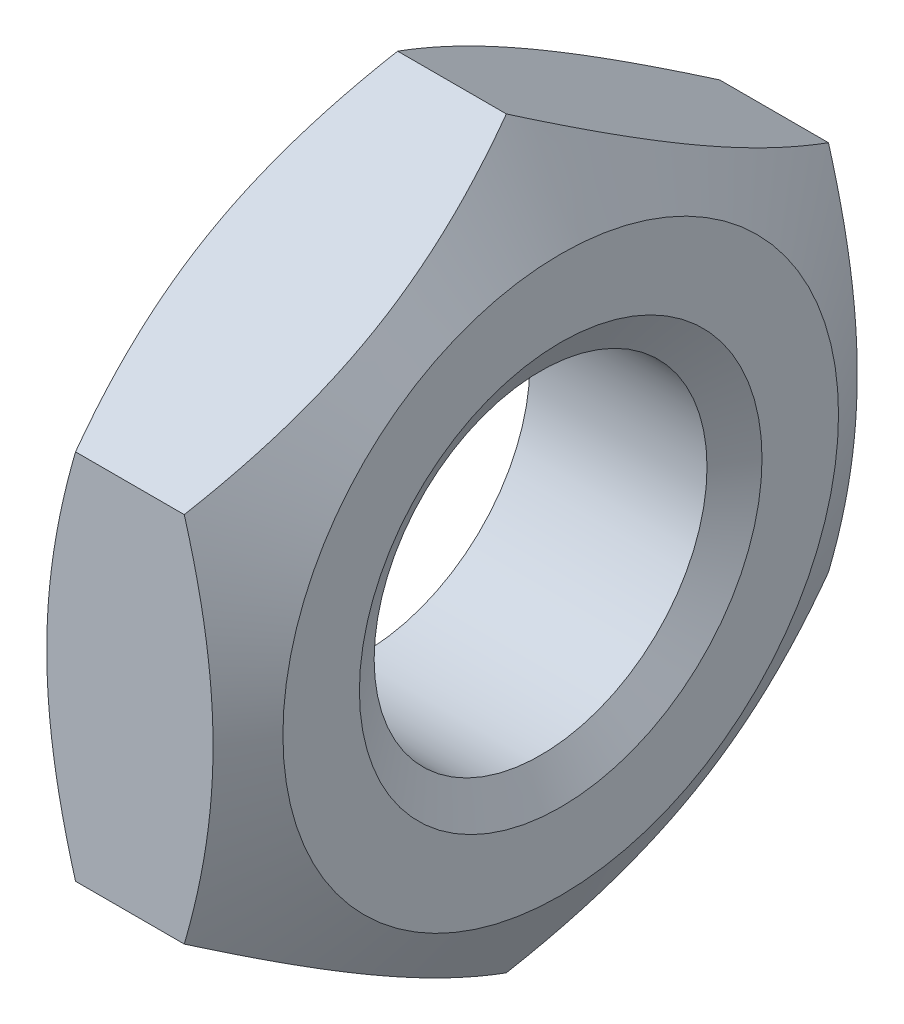
ISO-10303-21;
HEADER;
FILE_DESCRIPTION(('STEP AP214'),'2;1');
FILE_NAME('part.step','',(''),(''),'','','');
FILE_SCHEMA(('AUTOMOTIVE_DESIGN { 1 0 10303 214 1 1 1 1 }'));
ENDSEC;
DATA;
#1=APPLICATION_CONTEXT('core data for automotive mechanical design processes');
#2=APPLICATION_PROTOCOL_DEFINITION('international standard','automotive_design',2000,#1);
#3=PRODUCT_CONTEXT('',#1,'mechanical');
#4=PRODUCT('Part','Part','',(#3));
#5=PRODUCT_RELATED_PRODUCT_CATEGORY('part','',(#4));
#6=PRODUCT_DEFINITION_FORMATION('','',#4);
#7=PRODUCT_DEFINITION_CONTEXT('part definition',#1,'design');
#8=PRODUCT_DEFINITION('design','',#6,#7);
#9=PRODUCT_DEFINITION_SHAPE('','',#8);
#10=(LENGTH_UNIT() NAMED_UNIT(*) SI_UNIT(.MILLI.,.METRE.));
#11=(NAMED_UNIT(*) PLANE_ANGLE_UNIT() SI_UNIT($,.RADIAN.));
#12=(NAMED_UNIT(*) SI_UNIT($,.STERADIAN.) SOLID_ANGLE_UNIT());
#13=UNCERTAINTY_MEASURE_WITH_UNIT(LENGTH_MEASURE(1.E-05),#10,'distance_accuracy_value','');
#14=(GEOMETRIC_REPRESENTATION_CONTEXT(3) GLOBAL_UNCERTAINTY_ASSIGNED_CONTEXT((#13)) GLOBAL_UNIT_ASSIGNED_CONTEXT((#10,
#11,#12)) REPRESENTATION_CONTEXT('',''));
#15=CARTESIAN_POINT('',(0.,0.,0.));
#16=DIRECTION('',(0.,0.,1.));
#17=DIRECTION('',(1.,0.,0.));
#18=AXIS2_PLACEMENT_3D('',#15,#16,#17);
#19=CARTESIAN_POINT('',(0.,-2.3094010767585,4.));
#20=DIRECTION('',(0.,0.,1.));
#21=DIRECTION('',(1.,0.,0.));
#22=AXIS2_PLACEMENT_3D('',#19,#20,#21);
#23=PLANE('',#22);
#24=CARTESIAN_POINT('',(2.02519172902946,2.30940110330032,3.99999996266875));
#25=CARTESIAN_POINT('',(2.08380065489005,2.10643272223138,3.99999998659229));
#26=CARTESIAN_POINT('',(2.13710239838394,1.90171231870286,3.99999999640651));
#27=CARTESIAN_POINT('',(2.23013898474599,1.48872691297369,4.00000000360213));
#28=CARTESIAN_POINT('',(2.26984091838746,1.28045457520873,4.0000000009536));
#29=CARTESIAN_POINT('',(2.33163984180098,0.866490915195501,3.99999999907));
#30=CARTESIAN_POINT('',(2.35414818560107,0.660863268713691,3.99999999975209));
#31=CARTESIAN_POINT('',(2.38101342577776,0.248640934240581,4.0000000002476));
#32=CARTESIAN_POINT('',(2.38539257422497,0.0420477435369604,4.00000000006209));
#33=CARTESIAN_POINT('',(2.37625918202696,-0.343949461151199,3.99999999994595));
#34=CARTESIAN_POINT('',(2.36498919270018,-0.523411397187139,3.99999999998543));
#35=CARTESIAN_POINT('',(2.32927716423957,-0.881166133306312,4.00000000001458));
#36=CARTESIAN_POINT('',(2.30482293789213,-1.05945769693567,4.0000000000042));
#37=CARTESIAN_POINT('',(2.24369210505748,-1.41794944174713,3.9999999999957));
#38=CARTESIAN_POINT('',(2.20675648986175,-1.59810427385144,3.99999999999785));
#39=CARTESIAN_POINT('',(2.12292825825384,-1.9557277061086,4.00000000000214));
#40=CARTESIAN_POINT('',(2.07605532549025,-2.13320088429495,4.00000000000428));
#41=CARTESIAN_POINT('',(2.02519178619822,-2.30940098992733,4.));
#42=B_SPLINE_CURVE_WITH_KNOTS('',3,(#24,#25,#26,#27,#28,#29,#30,#31,#32,#33,#34,#35,#36,#37,#38,
#39,#40,#41),.UNSPECIFIED.,.F.,.F.,(4,2,2,2,2,2,2,2,4),(0.,0.634032032068211,1.26958765129333,
1.8894152364649,2.50848180915627,3.04741557495782,3.58684837536442,4.1382432105287,
4.68855589077481),.UNSPECIFIED.);
#43=CARTESIAN_POINT('',(2.02519177366592,2.3094010984675,3.99999996239891));
#44=VERTEX_POINT('',#43);
#45=CARTESIAN_POINT('',(2.0251917736691,-2.30940103332947,4.));
#46=VERTEX_POINT('',#45);
#47=EDGE_CURVE('E92',#44,#46,#42,.T.);
#48=ORIENTED_EDGE('',*,*,#47,.F.);
#49=DIRECTION('',(1.,0.,0.));
#50=VECTOR('',#49,1.);
#51=CARTESIAN_POINT('',(0.,2.3094010767585,4.));
#52=LINE('',#51,#50);
#53=CARTESIAN_POINT('',(0.674808226341169,2.30940103334992,4.));
#54=VERTEX_POINT('',#53);
#55=EDGE_CURVE('E80',#54,#44,#52,.T.);
#56=ORIENTED_EDGE('',*,*,#55,.F.);
#57=CARTESIAN_POINT('',(0.674808213697576,-2.30940098993405,4.0000000001688));
#58=CARTESIAN_POINT('',(0.616199305908313,-2.10643260917216,4.00000000006062));
#59=CARTESIAN_POINT('',(0.562897571915449,-1.90171220823269,4.00000000001625));
#60=CARTESIAN_POINT('',(0.469860996806368,-1.48872680966051,3.99999999998371));
#61=CARTESIAN_POINT('',(0.430159064910296,-1.28045447646598,3.99999999999569));
#62=CARTESIAN_POINT('',(0.368360146600821,-0.86649082466348,4.0000000000042));
#63=CARTESIAN_POINT('',(0.34585180615922,-0.660863181822002,4.00000000000112));
#64=CARTESIAN_POINT('',(0.318986571642112,-0.248640855097901,3.99999999999888));
#65=CARTESIAN_POINT('',(0.314607425490309,-0.042047668502941,3.99999999999972));
#66=CARTESIAN_POINT('',(0.323740821321169,0.343949526319326,4.00000000000024));
#67=CARTESIAN_POINT('',(0.335010811904148,0.52341145661859,4.00000000000007));
#68=CARTESIAN_POINT('',(0.370722841889489,0.881166181293737,3.99999999999993));
#69=CARTESIAN_POINT('',(0.395177068507638,1.05945773921543,3.99999999999998));
#70=CARTESIAN_POINT('',(0.456307900966008,1.41794947215574,4.00000000000002));
#71=CARTESIAN_POINT('',(0.493243515467248,1.59810429810382,4.00000000000001));
#72=CARTESIAN_POINT('',(0.57707174493397,1.95572771815517,3.99999999999999));
#73=CARTESIAN_POINT('',(0.623944676249181,2.13320089029238,3.99999999999998));
#74=CARTESIAN_POINT('',(0.67480821381843,2.30940098996988,4.));
#75=B_SPLINE_CURVE_WITH_KNOTS('',3,(#57,#58,#59,#60,#61,#62,#63,#64,#65,#66,#67,#68,#69,#70,#71,
#72,#73,#74),.UNSPECIFIED.,.F.,.F.,(4,2,2,2,2,2,2,2,4),(0.,0.634032017419487,1.26958762251684,
1.88941519556962,2.50848175591866,3.04741550481462,3.58684828842628,4.13824310511423,
4.6885557667468),.UNSPECIFIED.);
#76=CARTESIAN_POINT('',(0.674808243645541,-2.30940106849074,4.00000001432018));
#77=VERTEX_POINT('',#76);
#78=EDGE_CURVE('E240',#77,#54,#75,.T.);
#79=ORIENTED_EDGE('',*,*,#78,.F.);
#80=DIRECTION('',(1.,0.,0.));
#81=VECTOR('',#80,1.);
#82=CARTESIAN_POINT('',(0.,-2.3094010767585,4.));
#83=LINE('',#82,#81);
#84=EDGE_CURVE('E95',#46,#77,#83,.F.);
#85=ORIENTED_EDGE('',*,*,#84,.F.);
#86=EDGE_LOOP('',(#48,#56,#79,#85));
#87=FACE_BOUND('',#86,.T.);
#88=ADVANCED_FACE('F17',(#87),#23,.T.);
#89=CARTESIAN_POINT('',(0.,2.3094010767585,4.));
#90=DIRECTION('',(0.,0.866025403784438,0.5));
#91=DIRECTION('',(0.,-0.5,0.866025403784438));
#92=AXIS2_PLACEMENT_3D('',#89,#90,#91);
#93=PLANE('',#92);
#94=CARTESIAN_POINT('',(2.02519178630979,4.61880211027537,7.52639028100862E-08));
#95=CARTESIAN_POINT('',(2.08380069409352,4.51731791979203,0.175775849110728));
#96=CARTESIAN_POINT('',(2.13710242808434,4.41495771928044,0.353068916973205));
#97=CARTESIAN_POINT('',(2.23013900319252,4.20846501996394,0.710724763510652));
#98=CARTESIAN_POINT('',(2.26984093508974,4.10432885337824,0.89109389496859));
#99=CARTESIAN_POINT('',(2.33163985340084,3.89734702748539,1.24959693367691));
#100=CARTESIAN_POINT('',(2.35414819384293,3.79453320606185,1.42767569609609));
#101=CARTESIAN_POINT('',(2.3810134283613,3.5884220426979,1.78467070304471));
#102=CARTESIAN_POINT('',(2.38539257451389,3.48512544940133,1.96358565088497));
#103=CARTESIAN_POINT('',(2.37625917868444,3.29212685199066,2.29786902739092));
#104=CARTESIAN_POINT('',(2.36498918810206,3.20239588684072,2.45328761804243));
#105=CARTESIAN_POINT('',(2.32927715811784,3.02351852450271,2.76311229793547));
#106=CARTESIAN_POINT('',(2.30482293150021,2.93437274554174,2.91751731637628));
#107=CARTESIAN_POINT('',(2.24369209904278,2.75512687907132,3.22798026414984));
#108=CARTESIAN_POINT('',(2.20675648454197,2.66504946609713,3.38399892003548));
#109=CARTESIAN_POINT('',(2.122928255076,2.48623775607118,3.69370988678865));
#110=CARTESIAN_POINT('',(2.07605532376112,2.39750117000245,3.84740616234988));
#111=CARTESIAN_POINT('',(2.02519178619216,2.3094011201636,3.99999992482017));
#112=B_SPLINE_CURVE_WITH_KNOTS('',3,(#94,#95,#96,#97,#98,#99,#100,#101,#102,#103,#104,#105,#106,
#107,#108,#109,#110,#111),.UNSPECIFIED.,.F.,.F.,(4,2,2,2,2,2,2,2,4),(0.,0.634032017418265,
1.26958762251472,1.88941519556702,2.50848175591544,3.04741550481212,3.58684828842455,
4.13824310511304,4.68855576674605),.UNSPECIFIED.);
#113=CARTESIAN_POINT('',(2.0251917563553,4.61880216179087,1.43307475137956E-08));
#114=VERTEX_POINT('',#113);
#115=EDGE_CURVE('E21',#114,#44,#112,.T.);
#116=ORIENTED_EDGE('',*,*,#115,.F.);
#117=DIRECTION('',(1.,0.,0.));
#118=VECTOR('',#117,1.);
#119=CARTESIAN_POINT('',(0.,4.61880215351701,0.));
#120=LINE('',#119,#118);
#121=CARTESIAN_POINT('',(0.674808226338649,4.61880213180835,3.760049169793E-08));
#122=VERTEX_POINT('',#121);
#123=EDGE_CURVE('E73',#122,#114,#120,.T.);
#124=ORIENTED_EDGE('',*,*,#123,.F.);
#125=CARTESIAN_POINT('',(0.674808270972119,2.30940103115837,4.00000000435076));
#126=CARTESIAN_POINT('',(0.616199345117388,2.41088524240304,3.82422424213583));
#127=CARTESIAN_POINT('',(0.562897601625639,2.51324545266315,3.64693117691203));
#128=CARTESIAN_POINT('',(0.469861015264466,2.71973816175649,3.289275327755));
#129=CARTESIAN_POINT('',(0.430159081621735,2.82387432834596,3.10890619102175));
#130=CARTESIAN_POINT('',(0.368360158206409,3.03085615672164,2.75040314426596));
#131=CARTESIAN_POINT('',(0.345851814405762,3.13366998055291,2.57232437903338));
#132=CARTESIAN_POINT('',(0.318986574227663,3.33978114821819,2.21532936562037));
#133=CARTESIAN_POINT('',(0.314607425779577,3.44307774340929,2.03641441412964));
#134=CARTESIAN_POINT('',(0.32374081797613,3.63607634565498,1.70213102901815));
#135=CARTESIAN_POINT('',(0.335010807302671,3.72580731370938,1.54671243341451));
#136=CARTESIAN_POINT('',(0.370722835763484,3.90468468179872,1.23688774361786));
#137=CARTESIAN_POINT('',(0.395177062111381,3.99383046360667,1.08248272022529));
#138=CARTESIAN_POINT('',(0.45630789494754,4.17307633600956,0.772019762159473));
#139=CARTESIAN_POINT('',(0.493243510144345,4.26315375206584,0.616001100939776));
#140=CARTESIAN_POINT('',(0.57707174175484,4.44196546820258,0.306290123610946));
#141=CARTESIAN_POINT('',(0.623944674519954,4.53070205729978,0.152593842808506));
#142=CARTESIAN_POINT('',(0.674808213813643,4.61880211011441,7.51755118235889E-08));
#143=B_SPLINE_CURVE_WITH_KNOTS('',3,(#125,#126,#127,#128,#129,#130,#131,#132,#133,#134,#135,
#136,#137,#138,#139,#140,#141,#142),.UNSPECIFIED.,.F.,.F.,(4,2,2,2,2,2,2,2,4),(0.,
0.634032032067056,1.26958765129137,1.88941523646246,2.50848180915321,3.04741557496818,
3.58684837538834,4.13824321056657,4.68855589082641),.UNSPECIFIED.);
#144=EDGE_CURVE('E83',#54,#122,#143,.T.);
#145=ORIENTED_EDGE('',*,*,#144,.F.);
#146=ORIENTED_EDGE('',*,*,#55,.T.);
#147=EDGE_LOOP('',(#116,#124,#145,#146));
#148=FACE_BOUND('',#147,.T.);
#149=ADVANCED_FACE('F82',(#148),#93,.T.);
#150=CARTESIAN_POINT('',(0.,4.61880215351701,0.));
#151=DIRECTION('',(0.,0.866025403784439,-0.499999999999999));
#152=DIRECTION('',(0.,0.499999999999999,0.866025403784439));
#153=AXIS2_PLACEMENT_3D('',#150,#151,#152);
#154=PLANE('',#153);
#155=CARTESIAN_POINT('',(2.02519172902824,2.30940103115588,-4.00000000432196));
#156=CARTESIAN_POINT('',(2.08380065489977,2.41088524242771,-3.8242242420812));
#157=CARTESIAN_POINT('',(2.13710239840265,2.5132454527103,-3.64693117682718));
#158=CARTESIAN_POINT('',(2.23013898477805,2.71973816184712,-3.28927532760122));
#159=CARTESIAN_POINT('',(2.26984091842357,2.82387432845763,-3.10890619082919));
#160=CARTESIAN_POINT('',(2.33163984182479,3.03085615683632,-2.75040314406652));
#161=CARTESIAN_POINT('',(2.35414818561507,3.13366998064903,-2.57232437886667));
#162=CARTESIAN_POINT('',(2.38101342577998,3.33978114827347,-2.21532936552485));
#163=CARTESIAN_POINT('',(2.38539257422557,3.44307774344226,-2.03641441407259));
#164=CARTESIAN_POINT('',(2.37625918179789,3.63607635047929,-1.70213102066215));
#165=CARTESIAN_POINT('',(2.36498919148778,3.72580732333701,-1.54671241673896));
#166=CARTESIAN_POINT('',(2.32927715970763,3.9046847009531,-1.23688771044151));
#167=CARTESIAN_POINT('',(2.30482293102077,3.99383048748431,-1.08248267886802));
#168=CARTESIAN_POINT('',(2.24369209235289,4.17307636944309,-0.772019704250904));
#169=CARTESIAN_POINT('',(2.2067564736211,4.26315379032731,-0.616001034668968));
#170=CARTESIAN_POINT('',(2.12292823417202,4.44196551594428,-0.306290040919895));
#171=CARTESIAN_POINT('',(2.07605529710799,4.53070210969441,-0.15259375205835));
#172=CARTESIAN_POINT('',(2.02519175329197,4.61880216709671,2.35207428871448E-08));
#173=B_SPLINE_CURVE_WITH_KNOTS('',3,(#155,#156,#157,#158,#159,#160,#161,#162,#163,#164,#165,
#166,#167,#168,#169,#170,#171,#172),.UNSPECIFIED.,.F.,.F.,(4,2,2,2,2,2,2,2,4),(0.,
0.634032032183856,1.26958765153942,1.88941523659392,2.50848180915746,3.04741560383323,
3.58684843322087,4.13824329887117,4.68855600937118),.UNSPECIFIED.);
#174=CARTESIAN_POINT('',(2.02519177366628,2.30940103333923,-4.));
#175=VERTEX_POINT('',#174);
#176=EDGE_CURVE('E94',#175,#114,#173,.T.);
#177=ORIENTED_EDGE('',*,*,#176,.F.);
#178=DIRECTION('',(-1.,0.,0.));
#179=VECTOR('',#178,1.);
#180=CARTESIAN_POINT('',(0.,2.30940107675851,-4.));
#181=LINE('',#180,#179);
#182=CARTESIAN_POINT('',(0.674808226334158,2.30940109847495,-3.99999996238602));
#183=VERTEX_POINT('',#182);
#184=EDGE_CURVE('E224',#183,#175,#181,.F.);
#185=ORIENTED_EDGE('',*,*,#184,.F.);
#186=CARTESIAN_POINT('',(0.674808270980456,4.61880213448834,4.16832729183814E-08));
#187=CARTESIAN_POINT('',(0.616199345123098,4.51731796466597,-0.175775744446881));
#188=CARTESIAN_POINT('',(0.562897601629969,4.41495777139847,-0.353068819481787));
#189=CARTESIAN_POINT('',(0.469861015267162,4.20846507476345,-0.71072467583281));
#190=CARTESIAN_POINT('',(0.430159081624179,4.10432890358786,-0.891093809919018));
#191=CARTESIAN_POINT('',(0.368360158208106,3.89734707195025,-1.2495968547929));
#192=CARTESIAN_POINT('',(0.345851814406967,3.79453324929971,-1.4276756207078));
#193=CARTESIAN_POINT('',(0.318986574228041,3.58842208249181,-1.78467063461715));
#194=CARTESIAN_POINT('',(0.314607425779621,3.4851254869792,-1.96358558592296));
#195=CARTESIAN_POINT('',(0.323740817975579,3.29212688453309,-2.29786897091718));
#196=CARTESIAN_POINT('',(0.335010807301651,3.20239591654802,-2.4532875665586));
#197=CARTESIAN_POINT('',(0.370722835761278,3.0235185485111,-2.76311225638104));
#198=CARTESIAN_POINT('',(0.395177062108456,2.93437276668614,-2.91751727976157));
#199=CARTESIAN_POINT('',(0.456307894942975,2.75512689427043,-3.22798023781558));
#200=CARTESIAN_POINT('',(0.493243510138855,2.66504947821883,-3.38399889903577));
#201=CARTESIAN_POINT('',(0.577071741747384,2.4862377620914,-3.69370987636565));
#202=CARTESIAN_POINT('',(0.623944674511459,2.39750117299881,-3.84740615716865));
#203=CARTESIAN_POINT('',(0.674808213804085,2.30940112017767,-3.99999992479581));
#204=B_SPLINE_CURVE_WITH_KNOTS('',3,(#186,#187,#188,#189,#190,#191,#192,#193,#194,#195,#196,
#197,#198,#199,#200,#201,#202,#203),.UNSPECIFIED.,.F.,.F.,(4,2,2,2,2,2,2,2,4),(0.,
0.634032032069154,1.26958765129548,1.88941523646838,2.50848180916096,3.04741557497001,
3.58684837538419,4.13824321055625,4.68855589081002),.UNSPECIFIED.);
#205=EDGE_CURVE('E162',#122,#183,#204,.T.);
#206=ORIENTED_EDGE('',*,*,#205,.F.);
#207=ORIENTED_EDGE('',*,*,#123,.T.);
#208=EDGE_LOOP('',(#177,#185,#206,#207));
#209=FACE_BOUND('',#208,.T.);
#210=ADVANCED_FACE('F170',(#209),#154,.T.);
#211=CARTESIAN_POINT('',(0.,2.30940107675851,-4.));
#212=DIRECTION('',(0.,0.,-1.));
#213=DIRECTION('',(-1.,0.,0.));
#214=AXIS2_PLACEMENT_3D('',#211,#212,#213);
#215=PLANE('',#214);
#216=CARTESIAN_POINT('',(2.02519172902911,-2.30940110333139,-3.99999996268191));
#217=CARTESIAN_POINT('',(2.08380065488503,-2.10643272226138,-3.99999998659701));
#218=CARTESIAN_POINT('',(2.13710239837736,-1.90171231873257,-3.99999999640777));
#219=CARTESIAN_POINT('',(2.23013898473917,-1.48872691300343,-4.00000000360086));
#220=CARTESIAN_POINT('',(2.26984091838194,-1.28045457523877,-4.00000000095326));
#221=CARTESIAN_POINT('',(2.33163984179746,-0.866490915225834,-3.99999999907033));
#222=CARTESIAN_POINT('',(2.35414818559827,-0.660863268744019,-3.99999999975218));
#223=CARTESIAN_POINT('',(2.38101342577661,-0.248640934270915,-4.00000000024752));
#224=CARTESIAN_POINT('',(2.38539257422478,-0.0420477435673052,-4.00000000006207));
#225=CARTESIAN_POINT('',(2.37625918202837,0.343949461124968,-3.99999999994596));
#226=CARTESIAN_POINT('',(2.36498919270195,0.52341139716501,-3.99999999998543));
#227=CARTESIAN_POINT('',(2.32927716424141,0.881166133292388,-4.00000000001458));
#228=CARTESIAN_POINT('',(2.30482293789367,1.05945769692585,-4.0000000000042));
#229=CARTESIAN_POINT('',(2.24369210505788,1.41794944174555,-3.9999999999957));
#230=CARTESIAN_POINT('',(2.20675648986128,1.59810427385399,-3.99999999999785));
#231=CARTESIAN_POINT('',(2.12292825825121,1.95572770611926,-4.00000000000214));
#232=CARTESIAN_POINT('',(2.07605532548632,2.13320088430959,-4.00000000000428));
#233=CARTESIAN_POINT('',(2.02519178619286,2.30940098994589,-4.));
#234=B_SPLINE_CURVE_WITH_KNOTS('',3,(#216,#217,#218,#219,#220,#221,#222,#223,#224,#225,#226,
#227,#228,#229,#230,#231,#232,#233),.UNSPECIFIED.,.F.,.F.,(4,2,2,2,2,2,2,2,4),(0.,
0.634032032067868,1.26958765129295,1.88941523646471,2.50848180915614,3.04741557496986,
3.58684837538874,4.13824321056568,4.68855589082427),.UNSPECIFIED.);
#235=CARTESIAN_POINT('',(2.02519177366377,-2.30940109846379,-3.99999996240534));
#236=VERTEX_POINT('',#235);
#237=EDGE_CURVE('E130',#236,#175,#234,.T.);
#238=ORIENTED_EDGE('',*,*,#237,.F.);
#239=DIRECTION('',(1.,0.,0.));
#240=VECTOR('',#239,1.);
#241=CARTESIAN_POINT('',(0.,-2.30940107675849,-4.00000000000001));
#242=LINE('',#241,#240);
#243=CARTESIAN_POINT('',(0.674808226333928,-2.30940103332483,-4.00000000000001));
#244=VERTEX_POINT('',#243);
#245=EDGE_CURVE('E226',#244,#236,#242,.T.);
#246=ORIENTED_EDGE('',*,*,#245,.F.);
#247=CARTESIAN_POINT('',(0.674808270987895,2.3094011033273,-3.99999996266079));
#248=CARTESIAN_POINT('',(0.616199345123411,2.10643272225825,-3.99999998658943));
#249=CARTESIAN_POINT('',(0.562897601627434,1.90171231872913,-3.99999999640574));
#250=CARTESIAN_POINT('',(0.469861015262843,1.48872691299835,-4.00000000360289));
#251=CARTESIAN_POINT('',(0.430159081620924,1.28045457523236,-4.0000000009538));
#252=CARTESIAN_POINT('',(0.368360158206162,0.86649091521729,-3.9999999990698));
#253=CARTESIAN_POINT('',(0.345851814405277,0.660863268734651,-3.99999999975204));
#254=CARTESIAN_POINT('',(0.318986574227243,0.248640934259779,-4.00000000024766));
#255=CARTESIAN_POINT('',(0.314607425779465,0.0420477435552245,-4.0000000000621));
#256=CARTESIAN_POINT('',(0.323740817976572,-0.34394946113455,-3.99999999994593));
#257=CARTESIAN_POINT('',(0.335010807302971,-0.523411397171167,-3.99999999998543));
#258=CARTESIAN_POINT('',(0.370722835762953,-0.881166133291699,-4.00000000001459));
#259=CARTESIAN_POINT('',(0.395177062110157,-1.05945769692174,-4.0000000000042));
#260=CARTESIAN_POINT('',(0.456307894944457,-1.41794944173466,-3.9999999999957));
#261=CARTESIAN_POINT('',(0.49324351014009,-1.59810427383973,-3.99999999999785));
#262=CARTESIAN_POINT('',(0.577071741747921,-1.95572770609842,-4.00000000000214));
#263=CARTESIAN_POINT('',(0.623944674511547,-2.13320088428555,-4.00000000000428));
#264=CARTESIAN_POINT('',(0.67480821380365,-2.30940098991868,-4.));
#265=B_SPLINE_CURVE_WITH_KNOTS('',3,(#247,#248,#249,#250,#251,#252,#253,#254,#255,#256,#257,
#258,#259,#260,#261,#262,#263,#264),.UNSPECIFIED.,.F.,.F.,(4,2,2,2,2,2,2,2,4),(0.,
0.634032032071507,1.26958765129981,1.88941523647415,2.50848180916833,3.04741557497183,
3.58684837538035,4.13824321054683,4.68855589079517),.UNSPECIFIED.);
#266=EDGE_CURVE('E153',#183,#244,#265,.T.);
#267=ORIENTED_EDGE('',*,*,#266,.F.);
#268=ORIENTED_EDGE('',*,*,#184,.T.);
#269=EDGE_LOOP('',(#238,#246,#267,#268));
#270=FACE_BOUND('',#269,.T.);
#271=ADVANCED_FACE('F142',(#270),#215,.T.);
#272=CARTESIAN_POINT('',(0.,-2.30940107675849,-4.00000000000001));
#273=DIRECTION('',(0.,-0.866025403784438,-0.500000000000001));
#274=DIRECTION('',(0.,0.500000000000001,-0.866025403784438));
#275=AXIS2_PLACEMENT_3D('',#272,#273,#274);
#276=PLANE('',#275);
#277=CARTESIAN_POINT('',(2.02519172902911,-4.61880213448504,4.16718528164509E-08));
#278=CARTESIAN_POINT('',(2.08380065488503,-4.51731796466112,-0.175775744457339));
#279=CARTESIAN_POINT('',(2.13710239837736,-4.41495777139308,-0.353068819491671));
#280=CARTESIAN_POINT('',(2.23013898473917,-4.2084650747579,-0.710724675841887));
#281=CARTESIAN_POINT('',(2.26984091838194,-4.10432890358267,-0.891093809927865));
#282=CARTESIAN_POINT('',(2.33163984179747,-3.89734707194554,-1.24959685480119));
#283=CARTESIAN_POINT('',(2.35414818559827,-3.79453324929514,-1.42767562071576));
#284=CARTESIAN_POINT('',(2.38101342577661,-3.58842208248756,-1.78467063462445));
#285=CARTESIAN_POINT('',(2.38539257422478,-3.48512548697516,-1.96358558592993));
#286=CARTESIAN_POINT('',(2.37625918202834,-3.29212688452763,-2.29786897092663));
#287=CARTESIAN_POINT('',(2.36498919270173,-3.20239591654095,-2.45328756657085));
#288=CARTESIAN_POINT('',(2.32927716424061,-3.02351854850082,-2.76311225639883));
#289=CARTESIAN_POINT('',(2.30482293789247,-2.93437276667427,-2.91751727978211));
#290=CARTESIAN_POINT('',(2.24369210505565,-2.75512689425538,-3.22798023784164));
#291=CARTESIAN_POINT('',(2.20675648985843,-2.66504947820217,-3.38399889906462));
#292=CARTESIAN_POINT('',(2.12292825824698,-2.48623776207158,-3.69370987639996));
#293=CARTESIAN_POINT('',(2.07605532548133,-2.39750117297745,-3.84740615720564));
#294=CARTESIAN_POINT('',(2.02519178618708,-2.30940112015478,-3.99999992483543));
#295=B_SPLINE_CURVE_WITH_KNOTS('',3,(#277,#278,#279,#280,#281,#282,#283,#284,#285,#286,#287,
#288,#289,#290,#291,#292,#293,#294),.UNSPECIFIED.,.F.,.F.,(4,2,2,2,2,2,2,2,4),(0.,
0.634032032067891,1.269587651293,1.88941523646474,2.50848180915615,3.04741557497494,
3.58684837539893,4.13824321058123,4.68855589084515),.UNSPECIFIED.);
#296=CARTESIAN_POINT('',(2.02519177366378,-4.61880213181171,3.75946749404755E-08));
#297=VERTEX_POINT('',#296);
#298=EDGE_CURVE('E98',#297,#236,#295,.T.);
#299=ORIENTED_EDGE('',*,*,#298,.F.);
#300=DIRECTION('',(1.,0.,0.));
#301=VECTOR('',#300,1.);
#302=CARTESIAN_POINT('',(0.,-4.61880215351701,0.));
#303=LINE('',#302,#301);
#304=CARTESIAN_POINT('',(0.674808226337979,-4.61880213180719,-3.76025024012869E-08));
#305=VERTEX_POINT('',#304);
#306=EDGE_CURVE('E228',#305,#297,#303,.T.);
#307=ORIENTED_EDGE('',*,*,#306,.F.);
#308=CARTESIAN_POINT('',(0.674808270988646,-2.30940103113623,-4.00000000434069));
#309=CARTESIAN_POINT('',(0.616199345123922,-2.41088524239384,-3.82422424213436));
#310=CARTESIAN_POINT('',(0.562897601627818,-2.51324545265971,-3.64693117691332));
#311=CARTESIAN_POINT('',(0.469861015263077,-2.71973816175816,-3.28927532775677));
#312=CARTESIAN_POINT('',(0.430159081621134,-2.82387432834697,-3.10890619102123));
#313=CARTESIAN_POINT('',(0.368360158206308,-3.03085615672295,-2.75040314426249));
#314=CARTESIAN_POINT('',(0.345851814405381,-3.13366998055513,-2.5723243790292));
#315=CARTESIAN_POINT('',(0.318986574227276,-3.33978114822183,-2.21532936561438));
#316=CARTESIAN_POINT('',(0.314607425779468,-3.44307774341343,-2.03641441412254));
#317=CARTESIAN_POINT('',(0.323740817976582,-3.6360763456589,-1.70213102901127));
#318=CARTESIAN_POINT('',(0.335010807303194,-3.72580731371258,-1.54671243340896));
#319=CARTESIAN_POINT('',(0.370722835763933,-3.9046846818004,-1.23688774361496));
#320=CARTESIAN_POINT('',(0.395177062111681,-3.99383046360758,-1.08248272022372));
#321=CARTESIAN_POINT('',(0.456307894947352,-4.17307633600898,-0.772019762160468));
#322=CARTESIAN_POINT('',(0.493243510143821,-4.26315375206456,-0.616001100942003));
#323=CARTESIAN_POINT('',(0.577071741753515,-4.44196546819992,-0.30629012361555));
#324=CARTESIAN_POINT('',(0.623944674518167,-4.53070205729646,-0.152593842814255));
#325=CARTESIAN_POINT('',(0.674808213811352,-4.61880211011044,-7.51823861744825E-08));
#326=B_SPLINE_CURVE_WITH_KNOTS('',3,(#308,#309,#310,#311,#312,#313,#314,#315,#316,#317,#318,
#319,#320,#321,#322,#323,#324,#325),.UNSPECIFIED.,.F.,.F.,(4,2,2,2,2,2,2,2,4),(0.,
0.634032032071725,1.26958765130025,1.88941523647471,2.50848180916902,3.0474155749795,
3.58684837539503,4.13824321056889,4.68855589082456),.UNSPECIFIED.);
#327=EDGE_CURVE('E40',#244,#305,#326,.T.);
#328=ORIENTED_EDGE('',*,*,#327,.F.);
#329=ORIENTED_EDGE('',*,*,#245,.T.);
#330=EDGE_LOOP('',(#299,#307,#328,#329));
#331=FACE_BOUND('',#330,.T.);
#332=ADVANCED_FACE('F139',(#331),#276,.T.);
#333=CARTESIAN_POINT('',(0.,-4.61880215351701,0.));
#334=DIRECTION('',(0.,-0.866025403784439,0.5));
#335=DIRECTION('',(0.,-0.5,-0.866025403784439));
#336=AXIS2_PLACEMENT_3D('',#333,#334,#335);
#337=PLANE('',#336);
#338=CARTESIAN_POINT('',(2.02519172901892,-2.30940103114136,4.00000000433489));
#339=CARTESIAN_POINT('',(2.08380065488283,-2.41088524239809,3.82422424212811));
#340=CARTESIAN_POINT('',(2.13710239837847,-2.51324545266354,3.646931176907));
#341=CARTESIAN_POINT('',(2.2301389847426,-2.71973816176154,3.28927532775063));
#342=CARTESIAN_POINT('',(2.2698409183844,-2.82387432835033,3.10890619101534));
#343=CARTESIAN_POINT('',(2.33163984179885,-3.03085615672616,2.75040314425702));
#344=CARTESIAN_POINT('',(2.35414818559956,-3.13366998055821,2.57232437902391));
#345=CARTESIAN_POINT('',(2.38101342577728,-3.33978114822466,2.21532936560946));
#346=CARTESIAN_POINT('',(2.38539257422492,-3.44307774341616,2.03641441411783));
#347=CARTESIAN_POINT('',(2.37625918202749,-3.63607634566217,1.70213102900563));
#348=CARTESIAN_POINT('',(2.36498919270061,-3.72580731371649,1.54671243340218));
#349=CARTESIAN_POINT('',(2.32927716423917,-3.90468468180561,1.23688774360594));
#350=CARTESIAN_POINT('',(2.30482293789098,-3.99383046361342,1.0824827202136));
#351=CARTESIAN_POINT('',(2.24369210505429,-4.17307633601612,0.772019762148111));
#352=CARTESIAN_POINT('',(2.20675648985723,-4.26315375207234,0.616001100928527));
#353=CARTESIAN_POINT('',(2.12292825824628,-4.44196546820897,0.306290123599881));
#354=CARTESIAN_POINT('',(2.07605532548095,-4.53070205730613,0.152593842797511));
#355=CARTESIAN_POINT('',(2.02519178618708,-4.61880211012072,7.51645822365919E-08));
#356=B_SPLINE_CURVE_WITH_KNOTS('',3,(#338,#339,#340,#341,#342,#343,#344,#345,#346,#347,#348,
#349,#350,#351,#352,#353,#354,#355),.UNSPECIFIED.,.F.,.F.,(4,2,2,2,2,2,2,2,4),(0.,
0.634032032070947,1.26958765129871,1.88941523647247,2.50848180916607,3.04741557498051,
3.58684837540002,4.13824321057802,4.68855589083779),.UNSPECIFIED.);
#357=EDGE_CURVE('E97',#46,#297,#356,.T.);
#358=ORIENTED_EDGE('',*,*,#357,.F.);
#359=ORIENTED_EDGE('',*,*,#84,.T.);
#360=CARTESIAN_POINT('',(0.67480827097524,-4.61880213445935,-4.16530159621854E-08));
#361=CARTESIAN_POINT('',(0.616199345104189,-4.51731796462455,0.175775744511462));
#362=CARTESIAN_POINT('',(0.562897601601528,-4.41495777134082,0.353068819579723));
#363=CARTESIAN_POINT('',(0.46986101522631,-4.20846507466733,0.710724676001236));
#364=CARTESIAN_POINT('',(0.430159081580773,-4.10432890346945,0.891093810124636));
#365=CARTESIAN_POINT('',(0.36836015817954,-3.89734707182832,1.24959685500358));
#366=CARTESIAN_POINT('',(0.345851814389289,-3.79453324919705,1.42767562088548));
#367=CARTESIAN_POINT('',(0.318986574224388,-3.58842208243093,1.78467063472272));
#368=CARTESIAN_POINT('',(0.314607425778799,-3.48512548694084,1.96358558598942));
#369=CARTESIAN_POINT('',(0.323740818206415,-3.29212687970379,2.29786897928174));
#370=CARTESIAN_POINT('',(0.335010808516293,-3.20239590691557,2.45328758324249));
#371=CARTESIAN_POINT('',(0.370722840295666,-3.02351852935217,2.76311228956527));
#372=CARTESIAN_POINT('',(0.395177068981988,-2.93437274280409,2.9175173211265));
#373=CARTESIAN_POINT('',(0.456307907648509,-2.75512686083279,3.22798029573127));
#374=CARTESIAN_POINT('',(0.493243526379479,-2.66504943995341,3.38399896531342));
#375=CARTESIAN_POINT('',(0.577071765826728,-2.48623771434608,3.69370995906296));
#376=CARTESIAN_POINT('',(0.623944702889758,-2.39750112060074,3.84740624792477));
#377=CARTESIAN_POINT('',(0.674808246704727,-2.30940106319208,4.00000002349774));
#378=B_SPLINE_CURVE_WITH_KNOTS('',3,(#360,#361,#362,#363,#364,#365,#366,#367,#368,#369,#370,
#371,#372,#373,#374,#375,#376,#377),.UNSPECIFIED.,.F.,.F.,(4,2,2,2,2,2,2,2,4),(0.,
0.634032032183584,1.26958765153889,1.88941523659323,2.50848180915662,3.0474156038257,
3.58684843320664,4.13824329884987,4.68855600934285),.UNSPECIFIED.);
#379=EDGE_CURVE('E152',#305,#77,#378,.T.);
#380=ORIENTED_EDGE('',*,*,#379,.F.);
#381=ORIENTED_EDGE('',*,*,#306,.T.);
#382=EDGE_LOOP('',(#358,#359,#380,#381));
#383=FACE_BOUND('',#382,.T.);
#384=ADVANCED_FACE('F112',(#383),#337,.T.);
#385=CARTESIAN_POINT('',(2.02114291204225,0.,0.));
#386=DIRECTION('',(-1.,0.,0.));
#387=DIRECTION('',(0.,0.,1.));
#388=AXIS2_PLACEMENT_3D('',#385,#386,#387);
#389=CONICAL_SURFACE('',#388,4.62581496583425,1.04719755003834);
#390=CARTESIAN_POINT('',(2.70000000067769,0.,0.));
#391=DIRECTION('',(-1.,0.,0.));
#392=DIRECTION('',(0.,0.,1.));
#393=AXIS2_PLACEMENT_3D('',#390,#391,#392);
#394=CIRCLE('',#393,3.45000000038453);
#395=CARTESIAN_POINT('',(2.70000000067769,0.,3.45000000038453));
#396=VERTEX_POINT('',#395);
#397=EDGE_CURVE('E214',#396,#396,#394,.F.);
#398=ORIENTED_EDGE('',*,*,#397,.F.);
#399=EDGE_LOOP('',(#398));
#400=FACE_BOUND('',#399,.T.);
#401=ORIENTED_EDGE('',*,*,#237,.T.);
#402=ORIENTED_EDGE('',*,*,#176,.T.);
#403=ORIENTED_EDGE('',*,*,#115,.T.);
#404=ORIENTED_EDGE('',*,*,#47,.T.);
#405=ORIENTED_EDGE('',*,*,#357,.T.);
#406=ORIENTED_EDGE('',*,*,#298,.T.);
#407=EDGE_LOOP('',(#401,#402,#403,#404,#405,#406));
#408=FACE_BOUND('',#407,.T.);
#409=ADVANCED_FACE('F90',(#400,#408),#389,.T.);
#410=CARTESIAN_POINT('',(0.678857087962115,0.,0.));
#411=DIRECTION('',(1.,0.,0.));
#412=DIRECTION('',(0.,0.,-1.));
#413=AXIS2_PLACEMENT_3D('',#410,#411,#412);
#414=CONICAL_SURFACE('',#413,4.62581496583425,1.04719755003834);
#415=CARTESIAN_POINT('',(-6.73327496189535E-10,0.,0.));
#416=DIRECTION('',(1.,0.,0.));
#417=DIRECTION('',(0.,0.,-1.));
#418=AXIS2_PLACEMENT_3D('',#415,#416,#417);
#419=CIRCLE('',#418,3.45000000038453);
#420=CARTESIAN_POINT('',(-6.73327496189535E-10,0.,-3.45000000038453));
#421=VERTEX_POINT('',#420);
#422=EDGE_CURVE('E215',#421,#421,#419,.T.);
#423=ORIENTED_EDGE('',*,*,#422,.T.);
#424=EDGE_LOOP('',(#423));
#425=FACE_BOUND('',#424,.T.);
#426=ORIENTED_EDGE('',*,*,#327,.T.);
#427=ORIENTED_EDGE('',*,*,#379,.T.);
#428=ORIENTED_EDGE('',*,*,#78,.T.);
#429=ORIENTED_EDGE('',*,*,#144,.T.);
#430=ORIENTED_EDGE('',*,*,#205,.T.);
#431=ORIENTED_EDGE('',*,*,#266,.T.);
#432=EDGE_LOOP('',(#426,#427,#428,#429,#430,#431));
#433=FACE_BOUND('',#432,.T.);
#434=ADVANCED_FACE('F111',(#425,#433),#414,.T.);
#435=CARTESIAN_POINT('',(2.7,0.,0.));
#436=DIRECTION('',(1.,0.,0.));
#437=DIRECTION('',(0.,0.,-1.));
#438=AXIS2_PLACEMENT_3D('',#435,#436,#437);
#439=PLANE('',#438);
#440=CARTESIAN_POINT('',(2.70000000023174,0.,0.));
#441=DIRECTION('',(1.,0.,0.));
#442=DIRECTION('',(0.,0.,-1.));
#443=AXIS2_PLACEMENT_3D('',#440,#441,#442);
#444=CIRCLE('',#443,2.50001270171651);
#445=CARTESIAN_POINT('',(2.70000000023174,0.,-2.50001270171651));
#446=VERTEX_POINT('',#445);
#447=EDGE_CURVE('E211',#446,#446,#444,.F.);
#448=ORIENTED_EDGE('',*,*,#447,.T.);
#449=EDGE_LOOP('',(#448));
#450=FACE_BOUND('',#449,.T.);
#451=ORIENTED_EDGE('',*,*,#397,.T.);
#452=EDGE_LOOP('',(#451));
#453=FACE_BOUND('',#452,.T.);
#454=ADVANCED_FACE('F200',(#450,#453),#439,.T.);
#455=CARTESIAN_POINT('',(0.,0.,0.));
#456=DIRECTION('',(1.,0.,0.));
#457=DIRECTION('',(0.,0.,-1.));
#458=AXIS2_PLACEMENT_3D('',#455,#456,#457);
#459=PLANE('',#458);
#460=CARTESIAN_POINT('',(-2.68985946392694E-10,0.,0.));
#461=DIRECTION('',(-1.,0.,0.));
#462=DIRECTION('',(0.,0.,1.));
#463=AXIS2_PLACEMENT_3D('',#460,#461,#462);
#464=CIRCLE('',#463,2.50001270177336);
#465=CARTESIAN_POINT('',(-2.68985946392694E-10,0.,2.50001270177336));
#466=VERTEX_POINT('',#465);
#467=EDGE_CURVE('E220',#466,#466,#464,.F.);
#468=ORIENTED_EDGE('',*,*,#467,.T.);
#469=EDGE_LOOP('',(#468));
#470=FACE_BOUND('',#469,.T.);
#471=ORIENTED_EDGE('',*,*,#422,.F.);
#472=EDGE_LOOP('',(#471));
#473=FACE_BOUND('',#472,.T.);
#474=ADVANCED_FACE('F197',(#470,#473),#459,.F.);
#475=CARTESIAN_POINT('',(2.70000000023174,0.,0.));
#476=DIRECTION('',(1.,0.,0.));
#477=DIRECTION('',(0.,0.,-1.));
#478=AXIS2_PLACEMENT_3D('',#475,#476,#477);
#479=CONICAL_SURFACE('',#478,2.50001270171651,1.04719755002042);
#480=ORIENTED_EDGE('',*,*,#447,.F.);
#481=EDGE_LOOP('',(#480));
#482=FACE_BOUND('',#481,.T.);
#483=CARTESIAN_POINT('',(2.45,0.,0.));
#484=DIRECTION('',(1.,0.,0.));
#485=DIRECTION('',(0.,0.,-1.));
#486=AXIS2_PLACEMENT_3D('',#483,#484,#485);
#487=CIRCLE('',#486,2.067);
#488=CARTESIAN_POINT('',(2.45,0.,-2.067));
#489=VERTEX_POINT('',#488);
#490=EDGE_CURVE('E31',#489,#489,#487,.F.);
#491=ORIENTED_EDGE('',*,*,#490,.T.);
#492=EDGE_LOOP('',(#491));
#493=FACE_BOUND('',#492,.T.);
#494=ADVANCED_FACE('F189',(#482,#493),#479,.F.);
#495=CARTESIAN_POINT('',(-1.70530256582424E-10,0.,0.));
#496=DIRECTION('',(-1.,0.,0.));
#497=DIRECTION('',(0.,0.,1.));
#498=AXIS2_PLACEMENT_3D('',#495,#496,#497);
#499=CONICAL_SURFACE('',#498,2.50001270160283,1.04719755002042);
#500=ORIENTED_EDGE('',*,*,#467,.F.);
#501=EDGE_LOOP('',(#500));
#502=FACE_BOUND('',#501,.T.);
#503=CARTESIAN_POINT('',(0.249999999999999,0.,0.));
#504=DIRECTION('',(1.,0.,0.));
#505=DIRECTION('',(0.,0.,-1.));
#506=AXIS2_PLACEMENT_3D('',#503,#504,#505);
#507=CIRCLE('',#506,2.067);
#508=CARTESIAN_POINT('',(0.249999999999999,0.,-2.067));
#509=VERTEX_POINT('',#508);
#510=EDGE_CURVE('E11',#509,#509,#507,.T.);
#511=ORIENTED_EDGE('',*,*,#510,.T.);
#512=EDGE_LOOP('',(#511));
#513=FACE_BOUND('',#512,.T.);
#514=ADVANCED_FACE('F183',(#502,#513),#499,.F.);
#515=CARTESIAN_POINT('',(-9.81492442379632,0.,0.));
#516=DIRECTION('',(1.,0.,0.));
#517=DIRECTION('',(0.,0.,-1.));
#518=AXIS2_PLACEMENT_3D('',#515,#516,#517);
#519=CYLINDRICAL_SURFACE('',#518,2.067);
#520=ORIENTED_EDGE('',*,*,#510,.F.);
#521=EDGE_LOOP('',(#520));
#522=FACE_BOUND('',#521,.T.);
#523=ORIENTED_EDGE('',*,*,#490,.F.);
#524=EDGE_LOOP('',(#523));
#525=FACE_BOUND('',#524,.T.);
#526=ADVANCED_FACE('F181',(#522,#525),#519,.F.);
#527=CLOSED_SHELL('',(#88,#149,#210,#271,#332,#384,#409,#434,#454,#474,#494,#514,#526));
#528=MANIFOLD_SOLID_BREP('B1',#527);
#529=ADVANCED_BREP_SHAPE_REPRESENTATION('',(#18,#528),#14);
#530=SHAPE_DEFINITION_REPRESENTATION(#9,#529);
ENDSEC;
END-ISO-10303-21;
